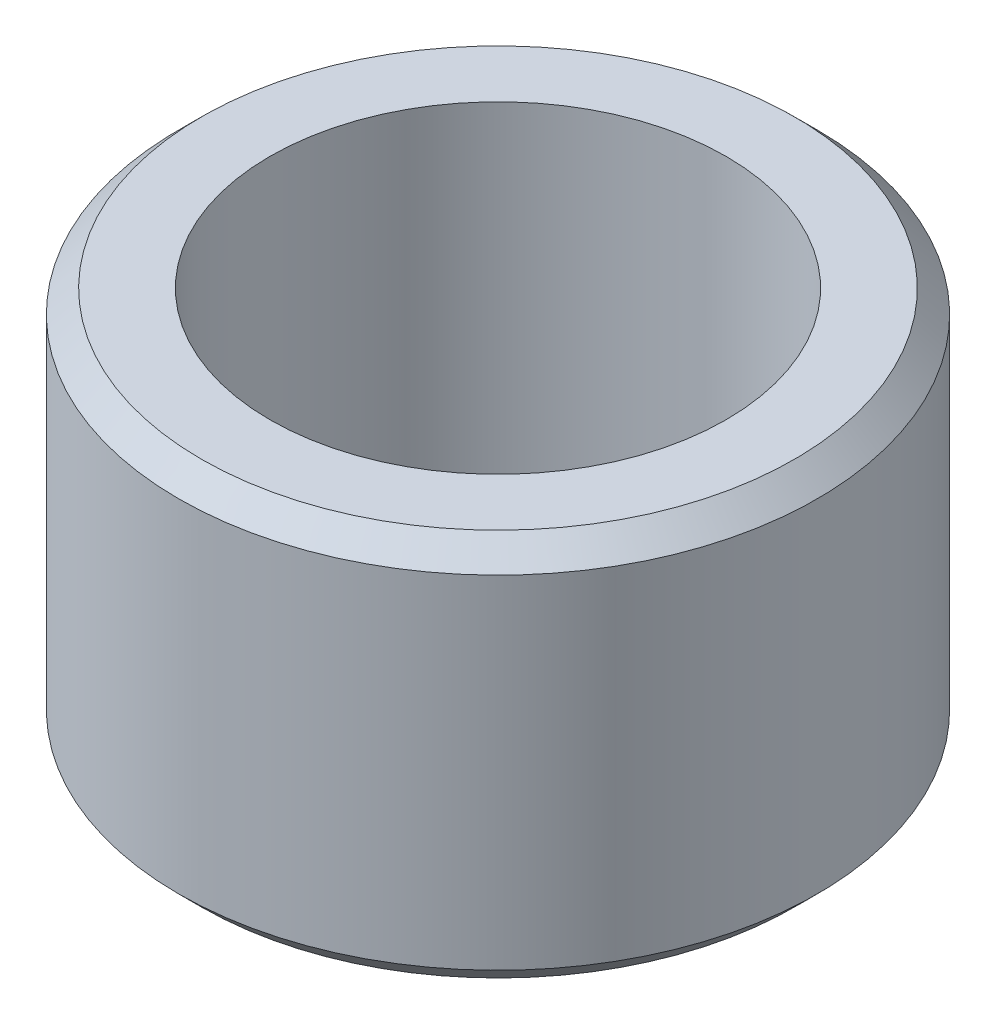
ISO-10303-21;
HEADER;
FILE_DESCRIPTION(('STEP AP214'),'2;1');
FILE_NAME('part.step','',(''),(''),'','','');
FILE_SCHEMA(('AUTOMOTIVE_DESIGN { 1 0 10303 214 1 1 1 1 }'));
ENDSEC;
DATA;
#1=APPLICATION_CONTEXT('core data for automotive mechanical design processes');
#2=APPLICATION_PROTOCOL_DEFINITION('international standard','automotive_design',2000,#1);
#3=PRODUCT_CONTEXT('',#1,'mechanical');
#4=PRODUCT('Part','Part','',(#3));
#5=PRODUCT_RELATED_PRODUCT_CATEGORY('part','',(#4));
#6=PRODUCT_DEFINITION_FORMATION('','',#4);
#7=PRODUCT_DEFINITION_CONTEXT('part definition',#1,'design');
#8=PRODUCT_DEFINITION('design','',#6,#7);
#9=PRODUCT_DEFINITION_SHAPE('','',#8);
#10=(LENGTH_UNIT() NAMED_UNIT(*) SI_UNIT(.MILLI.,.METRE.));
#11=(NAMED_UNIT(*) PLANE_ANGLE_UNIT() SI_UNIT($,.RADIAN.));
#12=(NAMED_UNIT(*) SI_UNIT($,.STERADIAN.) SOLID_ANGLE_UNIT());
#13=UNCERTAINTY_MEASURE_WITH_UNIT(LENGTH_MEASURE(1.E-05),#10,'distance_accuracy_value','');
#14=(GEOMETRIC_REPRESENTATION_CONTEXT(3) GLOBAL_UNCERTAINTY_ASSIGNED_CONTEXT((#13)) GLOBAL_UNIT_ASSIGNED_CONTEXT((#10,
#11,#12)) REPRESENTATION_CONTEXT('',''));
#15=CARTESIAN_POINT('',(0.,0.,0.));
#16=DIRECTION('',(0.,0.,1.));
#17=DIRECTION('',(1.,0.,0.));
#18=AXIS2_PLACEMENT_3D('',#15,#16,#17);
#19=CARTESIAN_POINT('',(0.,4.25,0.));
#20=DIRECTION('',(0.,1.,0.));
#21=DIRECTION('',(0.,0.,1.));
#22=AXIS2_PLACEMENT_3D('',#19,#20,#21);
#23=PLANE('',#22);
#24=CARTESIAN_POINT('',(0.,4.25,0.));
#25=DIRECTION('',(0.,1.,0.));
#26=DIRECTION('',(0.,0.,1.));
#27=AXIS2_PLACEMENT_3D('',#24,#25,#26);
#28=CIRCLE('',#27,6.5);
#29=CARTESIAN_POINT('',(0.,4.25,6.5));
#30=VERTEX_POINT('',#29);
#31=EDGE_CURVE('E10',#30,#30,#28,.T.);
#32=ORIENTED_EDGE('',*,*,#31,.T.);
#33=EDGE_LOOP('',(#32));
#34=FACE_BOUND('',#33,.T.);
#35=CARTESIAN_POINT('',(0.,4.25,0.));
#36=DIRECTION('',(0.,1.,0.));
#37=DIRECTION('',(0.,0.,1.));
#38=AXIS2_PLACEMENT_3D('',#35,#36,#37);
#39=CIRCLE('',#38,5.);
#40=CARTESIAN_POINT('',(0.,4.25,5.));
#41=VERTEX_POINT('',#40);
#42=EDGE_CURVE('E67',#41,#41,#39,.T.);
#43=ORIENTED_EDGE('',*,*,#42,.F.);
#44=EDGE_LOOP('',(#43));
#45=FACE_BOUND('',#44,.T.);
#46=ADVANCED_FACE('F44',(#34,#45),#23,.T.);
#47=CARTESIAN_POINT('',(0.,-4.25,0.));
#48=DIRECTION('',(0.,1.,0.));
#49=DIRECTION('',(0.,0.,1.));
#50=AXIS2_PLACEMENT_3D('',#47,#48,#49);
#51=PLANE('',#50);
#52=CARTESIAN_POINT('',(0.,-4.25,0.));
#53=DIRECTION('',(0.,1.,0.));
#54=DIRECTION('',(0.,0.,1.));
#55=AXIS2_PLACEMENT_3D('',#52,#53,#54);
#56=CIRCLE('',#55,6.49999999999999);
#57=CARTESIAN_POINT('',(0.,-4.25,6.49999999999999));
#58=VERTEX_POINT('',#57);
#59=EDGE_CURVE('E53',#58,#58,#56,.F.);
#60=ORIENTED_EDGE('',*,*,#59,.T.);
#61=EDGE_LOOP('',(#60));
#62=FACE_BOUND('',#61,.T.);
#63=CARTESIAN_POINT('',(0.,-4.25,0.));
#64=DIRECTION('',(0.,1.,0.));
#65=DIRECTION('',(0.,0.,1.));
#66=AXIS2_PLACEMENT_3D('',#63,#64,#65);
#67=CIRCLE('',#66,5.);
#68=CARTESIAN_POINT('',(0.,-4.25,5.));
#69=VERTEX_POINT('',#68);
#70=EDGE_CURVE('E72',#69,#69,#67,.T.);
#71=ORIENTED_EDGE('',*,*,#70,.T.);
#72=EDGE_LOOP('',(#71));
#73=FACE_BOUND('',#72,.T.);
#74=ADVANCED_FACE('F85',(#62,#73),#51,.F.);
#75=CARTESIAN_POINT('',(0.,4.25,0.));
#76=DIRECTION('',(0.,-1.,0.));
#77=DIRECTION('',(0.,0.,-1.));
#78=AXIS2_PLACEMENT_3D('',#75,#76,#77);
#79=CYLINDRICAL_SURFACE('',#78,7.);
#80=CARTESIAN_POINT('',(0.,-3.75,0.));
#81=DIRECTION('',(0.,1.,0.));
#82=DIRECTION('',(0.,0.,1.));
#83=AXIS2_PLACEMENT_3D('',#80,#81,#82);
#84=CIRCLE('',#83,7.);
#85=CARTESIAN_POINT('',(0.,-3.75,7.));
#86=VERTEX_POINT('',#85);
#87=EDGE_CURVE('E56',#86,#86,#84,.T.);
#88=ORIENTED_EDGE('',*,*,#87,.T.);
#89=EDGE_LOOP('',(#88));
#90=FACE_BOUND('',#89,.T.);
#91=CARTESIAN_POINT('',(0.,3.75,0.));
#92=DIRECTION('',(0.,1.,0.));
#93=DIRECTION('',(0.,0.,1.));
#94=AXIS2_PLACEMENT_3D('',#91,#92,#93);
#95=CIRCLE('',#94,7.);
#96=CARTESIAN_POINT('',(0.,3.75,7.));
#97=VERTEX_POINT('',#96);
#98=EDGE_CURVE('E61',#97,#97,#95,.F.);
#99=ORIENTED_EDGE('',*,*,#98,.T.);
#100=EDGE_LOOP('',(#99));
#101=FACE_BOUND('',#100,.T.);
#102=ADVANCED_FACE('F90',(#90,#101),#79,.T.);
#103=CARTESIAN_POINT('',(0.,4.25,0.));
#104=DIRECTION('',(0.,-1.,0.));
#105=DIRECTION('',(0.,0.,-1.));
#106=AXIS2_PLACEMENT_3D('',#103,#104,#105);
#107=CYLINDRICAL_SURFACE('',#106,5.);
#108=ORIENTED_EDGE('',*,*,#42,.T.);
#109=EDGE_LOOP('',(#108));
#110=FACE_BOUND('',#109,.T.);
#111=ORIENTED_EDGE('',*,*,#70,.F.);
#112=EDGE_LOOP('',(#111));
#113=FACE_BOUND('',#112,.T.);
#114=ADVANCED_FACE('F76',(#110,#113),#107,.F.);
#115=CARTESIAN_POINT('',(0.,-3.75,0.));
#116=DIRECTION('',(0.,1.,0.));
#117=DIRECTION('',(0.,0.,1.));
#118=AXIS2_PLACEMENT_3D('',#115,#116,#117);
#119=CONICAL_SURFACE('',#118,7.,0.785398163397453);
#120=ORIENTED_EDGE('',*,*,#59,.F.);
#121=EDGE_LOOP('',(#120));
#122=FACE_BOUND('',#121,.T.);
#123=ORIENTED_EDGE('',*,*,#87,.F.);
#124=EDGE_LOOP('',(#123));
#125=FACE_BOUND('',#124,.T.);
#126=ADVANCED_FACE('F96',(#122,#125),#119,.T.);
#127=CARTESIAN_POINT('',(0.,4.25,0.));
#128=DIRECTION('',(0.,-1.,0.));
#129=DIRECTION('',(0.,0.,-1.));
#130=AXIS2_PLACEMENT_3D('',#127,#128,#129);
#131=CONICAL_SURFACE('',#130,6.5,0.785398163397447);
#132=ORIENTED_EDGE('',*,*,#98,.F.);
#133=EDGE_LOOP('',(#132));
#134=FACE_BOUND('',#133,.T.);
#135=ORIENTED_EDGE('',*,*,#31,.F.);
#136=EDGE_LOOP('',(#135));
#137=FACE_BOUND('',#136,.T.);
#138=ADVANCED_FACE('F48',(#134,#137),#131,.T.);
#139=CLOSED_SHELL('',(#46,#74,#102,#114,#126,#138));
#140=MANIFOLD_SOLID_BREP('B2',#139);
#141=ADVANCED_BREP_SHAPE_REPRESENTATION('',(#18,#140),#14);
#142=SHAPE_DEFINITION_REPRESENTATION(#9,#141);
ENDSEC;
END-ISO-10303-21;
